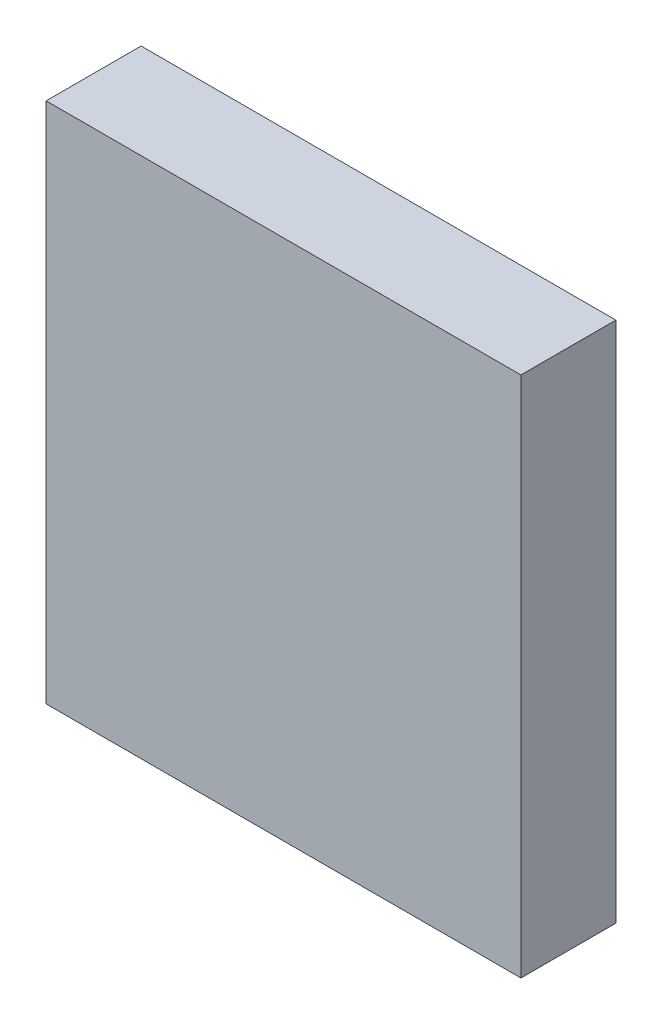
ISO-10303-21;
HEADER;
FILE_DESCRIPTION(('STEP AP214'),'2;1');
FILE_NAME('part.step','',(''),(''),'','','');
FILE_SCHEMA(('AUTOMOTIVE_DESIGN { 1 0 10303 214 1 1 1 1 }'));
ENDSEC;
DATA;
#1=APPLICATION_CONTEXT('core data for automotive mechanical design processes');
#2=APPLICATION_PROTOCOL_DEFINITION('international standard','automotive_design',2000,#1);
#3=PRODUCT_CONTEXT('',#1,'mechanical');
#4=PRODUCT('Part','Part','',(#3));
#5=PRODUCT_RELATED_PRODUCT_CATEGORY('part','',(#4));
#6=PRODUCT_DEFINITION_FORMATION('','',#4);
#7=PRODUCT_DEFINITION_CONTEXT('part definition',#1,'design');
#8=PRODUCT_DEFINITION('design','',#6,#7);
#9=PRODUCT_DEFINITION_SHAPE('','',#8);
#10=(LENGTH_UNIT() NAMED_UNIT(*) SI_UNIT(.MILLI.,.METRE.));
#11=(NAMED_UNIT(*) PLANE_ANGLE_UNIT() SI_UNIT($,.RADIAN.));
#12=(NAMED_UNIT(*) SI_UNIT($,.STERADIAN.) SOLID_ANGLE_UNIT());
#13=UNCERTAINTY_MEASURE_WITH_UNIT(LENGTH_MEASURE(1.E-05),#10,'distance_accuracy_value','');
#14=(GEOMETRIC_REPRESENTATION_CONTEXT(3) GLOBAL_UNCERTAINTY_ASSIGNED_CONTEXT((#13)) GLOBAL_UNIT_ASSIGNED_CONTEXT((#10,
#11,#12)) REPRESENTATION_CONTEXT('',''));
#15=CARTESIAN_POINT('',(0.,0.,0.));
#16=DIRECTION('',(0.,0.,1.));
#17=DIRECTION('',(1.,0.,0.));
#18=AXIS2_PLACEMENT_3D('',#15,#16,#17);
#19=CARTESIAN_POINT('',(4.99949216,5.49949116,2.));
#20=DIRECTION('',(0.,0.,1.));
#21=DIRECTION('',(1.,0.,0.));
#22=AXIS2_PLACEMENT_3D('',#19,#20,#21);
#23=PLANE('',#22);
#24=DIRECTION('',(0.,1.,0.));
#25=VECTOR('',#24,1.);
#26=CARTESIAN_POINT('',(-4.99949216,-5.49949116,2.));
#27=LINE('',#26,#25);
#28=CARTESIAN_POINT('',(-4.99949216,-5.49949116,2.));
#29=VERTEX_POINT('',#28);
#30=CARTESIAN_POINT('',(-4.99949216,5.49949116,2.));
#31=VERTEX_POINT('',#30);
#32=EDGE_CURVE('E58',#29,#31,#27,.T.);
#33=ORIENTED_EDGE('',*,*,#32,.F.);
#34=DIRECTION('',(1.,0.,0.));
#35=VECTOR('',#34,1.);
#36=CARTESIAN_POINT('',(4.99949216,-5.49949116,2.));
#37=LINE('',#36,#35);
#38=CARTESIAN_POINT('',(4.99949216,-5.49949116,2.));
#39=VERTEX_POINT('',#38);
#40=EDGE_CURVE('E53',#39,#29,#37,.F.);
#41=ORIENTED_EDGE('',*,*,#40,.F.);
#42=DIRECTION('',(0.,1.,0.));
#43=VECTOR('',#42,1.);
#44=CARTESIAN_POINT('',(4.99949216,5.49949116,2.));
#45=LINE('',#44,#43);
#46=CARTESIAN_POINT('',(4.99949216,5.49949116,2.));
#47=VERTEX_POINT('',#46);
#48=EDGE_CURVE('E68',#47,#39,#45,.F.);
#49=ORIENTED_EDGE('',*,*,#48,.F.);
#50=DIRECTION('',(1.,0.,0.));
#51=VECTOR('',#50,1.);
#52=CARTESIAN_POINT('',(-4.99949216,5.49949116,2.));
#53=LINE('',#52,#51);
#54=EDGE_CURVE('E20',#31,#47,#53,.T.);
#55=ORIENTED_EDGE('',*,*,#54,.F.);
#56=EDGE_LOOP('',(#33,#41,#49,#55));
#57=FACE_BOUND('',#56,.T.);
#58=ADVANCED_FACE('F17',(#57),#23,.T.);
#59=CARTESIAN_POINT('',(-4.99949216,5.49949116,0.));
#60=DIRECTION('',(0.,1.,0.));
#61=DIRECTION('',(0.,0.,1.));
#62=AXIS2_PLACEMENT_3D('',#59,#60,#61);
#63=PLANE('',#62);
#64=DIRECTION('',(0.,0.,-1.));
#65=VECTOR('',#64,1.);
#66=CARTESIAN_POINT('',(4.99949216,5.49949116,0.));
#67=LINE('',#66,#65);
#68=CARTESIAN_POINT('',(4.99949216,5.49949116,0.));
#69=VERTEX_POINT('',#68);
#70=EDGE_CURVE('E79',#69,#47,#67,.F.);
#71=ORIENTED_EDGE('',*,*,#70,.F.);
#72=DIRECTION('',(1.,0.,0.));
#73=VECTOR('',#72,1.);
#74=CARTESIAN_POINT('',(4.99949216,5.49949116,0.));
#75=LINE('',#74,#73);
#76=CARTESIAN_POINT('',(-4.99949216,5.49949116,0.));
#77=VERTEX_POINT('',#76);
#78=EDGE_CURVE('E74',#69,#77,#75,.F.);
#79=ORIENTED_EDGE('',*,*,#78,.T.);
#80=DIRECTION('',(0.,0.,1.));
#81=VECTOR('',#80,1.);
#82=CARTESIAN_POINT('',(-4.99949216,5.49949116,0.));
#83=LINE('',#82,#81);
#84=EDGE_CURVE('E63',#31,#77,#83,.F.);
#85=ORIENTED_EDGE('',*,*,#84,.F.);
#86=ORIENTED_EDGE('',*,*,#54,.T.);
#87=EDGE_LOOP('',(#71,#79,#85,#86));
#88=FACE_BOUND('',#87,.T.);
#89=ADVANCED_FACE('F73',(#88),#63,.T.);
#90=CARTESIAN_POINT('',(-4.99949216,-5.49949116,0.));
#91=DIRECTION('',(-1.,0.,0.));
#92=DIRECTION('',(0.,0.,1.));
#93=AXIS2_PLACEMENT_3D('',#90,#91,#92);
#94=PLANE('',#93);
#95=ORIENTED_EDGE('',*,*,#84,.T.);
#96=DIRECTION('',(0.,1.,0.));
#97=VECTOR('',#96,1.);
#98=CARTESIAN_POINT('',(-4.99949216,5.49949116,0.));
#99=LINE('',#98,#97);
#100=CARTESIAN_POINT('',(-4.99949216,-5.49949116,0.));
#101=VERTEX_POINT('',#100);
#102=EDGE_CURVE('E84',#77,#101,#99,.F.);
#103=ORIENTED_EDGE('',*,*,#102,.T.);
#104=DIRECTION('',(0.,0.,-1.));
#105=VECTOR('',#104,1.);
#106=CARTESIAN_POINT('',(-4.99949216,-5.49949116,0.));
#107=LINE('',#106,#105);
#108=EDGE_CURVE('E65',#29,#101,#107,.T.);
#109=ORIENTED_EDGE('',*,*,#108,.F.);
#110=ORIENTED_EDGE('',*,*,#32,.T.);
#111=EDGE_LOOP('',(#95,#103,#109,#110));
#112=FACE_BOUND('',#111,.T.);
#113=ADVANCED_FACE('F60',(#112),#94,.T.);
#114=CARTESIAN_POINT('',(4.99949216,-5.49949116,0.));
#115=DIRECTION('',(0.,-1.,0.));
#116=DIRECTION('',(0.,0.,-1.));
#117=AXIS2_PLACEMENT_3D('',#114,#115,#116);
#118=PLANE('',#117);
#119=ORIENTED_EDGE('',*,*,#108,.T.);
#120=DIRECTION('',(1.,0.,0.));
#121=VECTOR('',#120,1.);
#122=CARTESIAN_POINT('',(4.99949216,-5.49949116,0.));
#123=LINE('',#122,#121);
#124=CARTESIAN_POINT('',(4.99949216,-5.49949116,0.));
#125=VERTEX_POINT('',#124);
#126=EDGE_CURVE('E26',#101,#125,#123,.T.);
#127=ORIENTED_EDGE('',*,*,#126,.T.);
#128=DIRECTION('',(0.,0.,-1.));
#129=VECTOR('',#128,1.);
#130=CARTESIAN_POINT('',(4.99949216,-5.49949116,0.));
#131=LINE('',#130,#129);
#132=EDGE_CURVE('E34',#39,#125,#131,.T.);
#133=ORIENTED_EDGE('',*,*,#132,.F.);
#134=ORIENTED_EDGE('',*,*,#40,.T.);
#135=EDGE_LOOP('',(#119,#127,#133,#134));
#136=FACE_BOUND('',#135,.T.);
#137=ADVANCED_FACE('F88',(#136),#118,.T.);
#138=CARTESIAN_POINT('',(4.99949216,5.49949116,0.));
#139=DIRECTION('',(1.,0.,0.));
#140=DIRECTION('',(0.,0.,-1.));
#141=AXIS2_PLACEMENT_3D('',#138,#139,#140);
#142=PLANE('',#141);
#143=ORIENTED_EDGE('',*,*,#132,.T.);
#144=DIRECTION('',(0.,1.,0.));
#145=VECTOR('',#144,1.);
#146=CARTESIAN_POINT('',(4.99949216,5.49949116,0.));
#147=LINE('',#146,#145);
#148=EDGE_CURVE('E11',#125,#69,#147,.T.);
#149=ORIENTED_EDGE('',*,*,#148,.T.);
#150=ORIENTED_EDGE('',*,*,#70,.T.);
#151=ORIENTED_EDGE('',*,*,#48,.T.);
#152=EDGE_LOOP('',(#143,#149,#150,#151));
#153=FACE_BOUND('',#152,.T.);
#154=ADVANCED_FACE('F91',(#153),#142,.T.);
#155=CARTESIAN_POINT('',(4.99949216,5.49949116,0.));
#156=DIRECTION('',(0.,0.,1.));
#157=DIRECTION('',(1.,0.,0.));
#158=AXIS2_PLACEMENT_3D('',#155,#156,#157);
#159=PLANE('',#158);
#160=ORIENTED_EDGE('',*,*,#126,.F.);
#161=ORIENTED_EDGE('',*,*,#102,.F.);
#162=ORIENTED_EDGE('',*,*,#78,.F.);
#163=ORIENTED_EDGE('',*,*,#148,.F.);
#164=EDGE_LOOP('',(#160,#161,#162,#163));
#165=FACE_BOUND('',#164,.T.);
#166=ADVANCED_FACE('F90',(#165),#159,.F.);
#167=CLOSED_SHELL('',(#58,#89,#113,#137,#154,#166));
#168=MANIFOLD_SOLID_BREP('B1',#167);
#169=ADVANCED_BREP_SHAPE_REPRESENTATION('',(#18,#168),#14);
#170=SHAPE_DEFINITION_REPRESENTATION(#9,#169);
ENDSEC;
END-ISO-10303-21;
